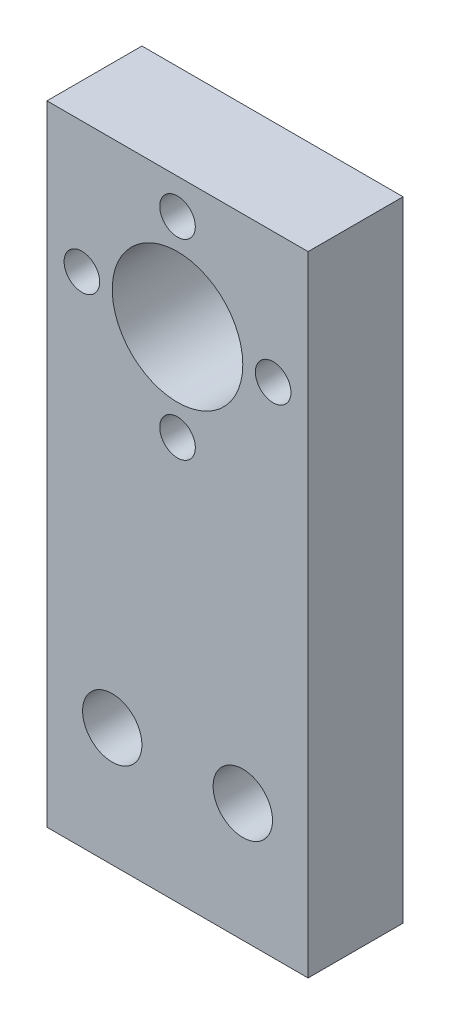
ISO-10303-21;
HEADER;
FILE_DESCRIPTION(('STEP AP214'),'2;1');
FILE_NAME('part.step','',(''),(''),'','','');
FILE_SCHEMA(('AUTOMOTIVE_DESIGN { 1 0 10303 214 1 1 1 1 }'));
ENDSEC;
DATA;
#1=APPLICATION_CONTEXT('core data for automotive mechanical design processes');
#2=APPLICATION_PROTOCOL_DEFINITION('international standard','automotive_design',2000,#1);
#3=PRODUCT_CONTEXT('',#1,'mechanical');
#4=PRODUCT('Part','Part','',(#3));
#5=PRODUCT_RELATED_PRODUCT_CATEGORY('part','',(#4));
#6=PRODUCT_DEFINITION_FORMATION('','',#4);
#7=PRODUCT_DEFINITION_CONTEXT('part definition',#1,'design');
#8=PRODUCT_DEFINITION('design','',#6,#7);
#9=PRODUCT_DEFINITION_SHAPE('','',#8);
#10=(LENGTH_UNIT() NAMED_UNIT(*) SI_UNIT(.MILLI.,.METRE.));
#11=(NAMED_UNIT(*) PLANE_ANGLE_UNIT() SI_UNIT($,.RADIAN.));
#12=(NAMED_UNIT(*) SI_UNIT($,.STERADIAN.) SOLID_ANGLE_UNIT());
#13=UNCERTAINTY_MEASURE_WITH_UNIT(LENGTH_MEASURE(1.E-05),#10,'distance_accuracy_value','');
#14=(GEOMETRIC_REPRESENTATION_CONTEXT(3) GLOBAL_UNCERTAINTY_ASSIGNED_CONTEXT((#13)) GLOBAL_UNIT_ASSIGNED_CONTEXT((#10,
#11,#12)) REPRESENTATION_CONTEXT('',''));
#15=CARTESIAN_POINT('',(0.,0.,0.));
#16=DIRECTION('',(0.,0.,1.));
#17=DIRECTION('',(1.,0.,0.));
#18=AXIS2_PLACEMENT_3D('',#15,#16,#17);
#19=CARTESIAN_POINT('',(0.,0.,8.));
#20=DIRECTION('',(0.,0.,1.));
#21=DIRECTION('',(1.,0.,0.));
#22=AXIS2_PLACEMENT_3D('',#19,#20,#21);
#23=PLANE('',#22);
#24=CARTESIAN_POINT('',(-7.00884955752212,4.74282834419709,8.));
#25=DIRECTION('',(0.,0.,1.));
#26=DIRECTION('',(1.,0.,0.));
#27=AXIS2_PLACEMENT_3D('',#24,#25,#26);
#28=CIRCLE('',#27,1.5);
#29=CARTESIAN_POINT('',(-5.50884955752212,4.74282834419709,8.));
#30=VERTEX_POINT('',#29);
#31=EDGE_CURVE('E138',#30,#30,#28,.T.);
#32=ORIENTED_EDGE('',*,*,#31,.F.);
#33=EDGE_LOOP('',(#32));
#34=FACE_BOUND('',#33,.T.);
#35=CARTESIAN_POINT('',(-7.00884955752212,20.8589415673073,8.));
#36=DIRECTION('',(0.,0.,1.));
#37=DIRECTION('',(1.,0.,0.));
#38=AXIS2_PLACEMENT_3D('',#35,#36,#37);
#39=CIRCLE('',#38,1.5);
#40=CARTESIAN_POINT('',(-5.50884955752212,20.8589415673073,8.));
#41=VERTEX_POINT('',#40);
#42=EDGE_CURVE('E126',#41,#41,#39,.T.);
#43=ORIENTED_EDGE('',*,*,#42,.F.);
#44=EDGE_LOOP('',(#43));
#45=FACE_BOUND('',#44,.T.);
#46=CARTESIAN_POINT('',(-1.50884955752212,-19.1991150442478,8.));
#47=DIRECTION('',(0.,0.,1.));
#48=DIRECTION('',(1.,0.,0.));
#49=AXIS2_PLACEMENT_3D('',#46,#47,#48);
#50=CIRCLE('',#49,2.5);
#51=CARTESIAN_POINT('',(0.99115044247788,-19.1991150442478,8.));
#52=VERTEX_POINT('',#51);
#53=EDGE_CURVE('E114',#52,#52,#50,.T.);
#54=ORIENTED_EDGE('',*,*,#53,.F.);
#55=EDGE_LOOP('',(#54));
#56=FACE_BOUND('',#55,.T.);
#57=DIRECTION('',(0.,1.,0.));
#58=VECTOR('',#57,1.);
#59=CARTESIAN_POINT('',(3.99115044247787,23.8008849557522,8.));
#60=LINE('',#59,#58);
#61=CARTESIAN_POINT('',(3.99115044247788,-29.1991150442478,8.));
#62=VERTEX_POINT('',#61);
#63=CARTESIAN_POINT('',(3.99115044247787,23.8008849557522,8.));
#64=VERTEX_POINT('',#63);
#65=EDGE_CURVE('E84',#62,#64,#60,.T.);
#66=ORIENTED_EDGE('',*,*,#65,.T.);
#67=DIRECTION('',(-1.,0.,0.));
#68=VECTOR('',#67,1.);
#69=CARTESIAN_POINT('',(-18.0088495575221,23.8008849557522,8.));
#70=LINE('',#69,#68);
#71=CARTESIAN_POINT('',(-18.0088495575221,23.8008849557522,8.));
#72=VERTEX_POINT('',#71);
#73=EDGE_CURVE('E79',#64,#72,#70,.T.);
#74=ORIENTED_EDGE('',*,*,#73,.T.);
#75=DIRECTION('',(0.,-1.,0.));
#76=VECTOR('',#75,1.);
#77=CARTESIAN_POINT('',(-18.0088495575221,23.8008849557522,8.));
#78=LINE('',#77,#76);
#79=CARTESIAN_POINT('',(-18.0088495575221,-29.1991150442478,8.));
#80=VERTEX_POINT('',#79);
#81=EDGE_CURVE('E82',#72,#80,#78,.T.);
#82=ORIENTED_EDGE('',*,*,#81,.T.);
#83=DIRECTION('',(1.,0.,0.));
#84=VECTOR('',#83,1.);
#85=CARTESIAN_POINT('',(-18.0088495575221,-29.1991150442478,8.));
#86=LINE('',#85,#84);
#87=EDGE_CURVE('E49',#80,#62,#86,.T.);
#88=ORIENTED_EDGE('',*,*,#87,.T.);
#89=EDGE_LOOP('',(#66,#74,#82,#88));
#90=FACE_BOUND('',#89,.T.);
#91=CARTESIAN_POINT('',(-12.5088495575221,-19.1991150442478,8.));
#92=DIRECTION('',(0.,0.,1.));
#93=DIRECTION('',(1.,0.,0.));
#94=AXIS2_PLACEMENT_3D('',#91,#92,#93);
#95=CIRCLE('',#94,2.5);
#96=CARTESIAN_POINT('',(-10.0088495575221,-19.1991150442478,8.));
#97=VERTEX_POINT('',#96);
#98=EDGE_CURVE('E99',#97,#97,#95,.T.);
#99=ORIENTED_EDGE('',*,*,#98,.F.);
#100=EDGE_LOOP('',(#99));
#101=FACE_BOUND('',#100,.T.);
#102=CARTESIAN_POINT('',(-7.00884955752212,12.8008849557522,8.));
#103=DIRECTION('',(0.,0.,1.));
#104=DIRECTION('',(1.,0.,0.));
#105=AXIS2_PLACEMENT_3D('',#102,#103,#104);
#106=CIRCLE('',#105,5.5);
#107=CARTESIAN_POINT('',(-1.50884955752212,12.8008849557522,8.));
#108=VERTEX_POINT('',#107);
#109=EDGE_CURVE('E120',#108,#108,#106,.T.);
#110=ORIENTED_EDGE('',*,*,#109,.F.);
#111=EDGE_LOOP('',(#110));
#112=FACE_BOUND('',#111,.T.);
#113=CARTESIAN_POINT('',(1.04920705403299,12.8008849557522,8.));
#114=DIRECTION('',(0.,0.,1.));
#115=DIRECTION('',(1.,0.,0.));
#116=AXIS2_PLACEMENT_3D('',#113,#114,#115);
#117=CIRCLE('',#116,1.5);
#118=CARTESIAN_POINT('',(2.54920705403299,12.8008849557522,8.));
#119=VERTEX_POINT('',#118);
#120=EDGE_CURVE('E132',#119,#119,#117,.T.);
#121=ORIENTED_EDGE('',*,*,#120,.F.);
#122=EDGE_LOOP('',(#121));
#123=FACE_BOUND('',#122,.T.);
#124=CARTESIAN_POINT('',(-15.0669061690772,12.8008849557522,8.));
#125=DIRECTION('',(0.,0.,1.));
#126=DIRECTION('',(1.,0.,0.));
#127=AXIS2_PLACEMENT_3D('',#124,#125,#126);
#128=CIRCLE('',#127,1.5);
#129=CARTESIAN_POINT('',(-13.5669061690772,12.8008849557522,8.));
#130=VERTEX_POINT('',#129);
#131=EDGE_CURVE('E144',#130,#130,#128,.T.);
#132=ORIENTED_EDGE('',*,*,#131,.F.);
#133=EDGE_LOOP('',(#132));
#134=FACE_BOUND('',#133,.T.);
#135=ADVANCED_FACE('F32',(#34,#45,#56,#90,#101,#112,#123,#134),#23,.T.);
#136=CARTESIAN_POINT('',(0.,0.,0.));
#137=DIRECTION('',(0.,0.,1.));
#138=DIRECTION('',(1.,0.,0.));
#139=AXIS2_PLACEMENT_3D('',#136,#137,#138);
#140=PLANE('',#139);
#141=DIRECTION('',(0.,1.,0.));
#142=VECTOR('',#141,1.);
#143=CARTESIAN_POINT('',(3.99115044247787,23.8008849557522,0.));
#144=LINE('',#143,#142);
#145=CARTESIAN_POINT('',(3.99115044247788,-29.1991150442478,0.));
#146=VERTEX_POINT('',#145);
#147=CARTESIAN_POINT('',(3.99115044247787,23.8008849557522,0.));
#148=VERTEX_POINT('',#147);
#149=EDGE_CURVE('E96',#146,#148,#144,.T.);
#150=ORIENTED_EDGE('',*,*,#149,.F.);
#151=DIRECTION('',(1.,0.,0.));
#152=VECTOR('',#151,1.);
#153=CARTESIAN_POINT('',(-18.0088495575221,-29.1991150442478,0.));
#154=LINE('',#153,#152);
#155=CARTESIAN_POINT('',(-18.0088495575221,-29.1991150442478,0.));
#156=VERTEX_POINT('',#155);
#157=EDGE_CURVE('E72',#156,#146,#154,.T.);
#158=ORIENTED_EDGE('',*,*,#157,.F.);
#159=DIRECTION('',(0.,-1.,0.));
#160=VECTOR('',#159,1.);
#161=CARTESIAN_POINT('',(-18.0088495575221,23.8008849557522,0.));
#162=LINE('',#161,#160);
#163=CARTESIAN_POINT('',(-18.0088495575221,23.8008849557522,0.));
#164=VERTEX_POINT('',#163);
#165=EDGE_CURVE('E66',#164,#156,#162,.T.);
#166=ORIENTED_EDGE('',*,*,#165,.F.);
#167=DIRECTION('',(-1.,0.,0.));
#168=VECTOR('',#167,1.);
#169=CARTESIAN_POINT('',(-18.0088495575221,23.8008849557522,0.));
#170=LINE('',#169,#168);
#171=EDGE_CURVE('E88',#148,#164,#170,.T.);
#172=ORIENTED_EDGE('',*,*,#171,.F.);
#173=EDGE_LOOP('',(#150,#158,#166,#172));
#174=FACE_BOUND('',#173,.T.);
#175=CARTESIAN_POINT('',(-12.5088495575221,-19.1991150442478,0.));
#176=DIRECTION('',(0.,0.,1.));
#177=DIRECTION('',(1.,0.,0.));
#178=AXIS2_PLACEMENT_3D('',#175,#176,#177);
#179=CIRCLE('',#178,2.5);
#180=CARTESIAN_POINT('',(-10.0088495575221,-19.1991150442478,0.));
#181=VERTEX_POINT('',#180);
#182=EDGE_CURVE('E111',#181,#181,#179,.T.);
#183=ORIENTED_EDGE('',*,*,#182,.T.);
#184=EDGE_LOOP('',(#183));
#185=FACE_BOUND('',#184,.T.);
#186=CARTESIAN_POINT('',(-1.50884955752212,-19.1991150442478,0.));
#187=DIRECTION('',(0.,0.,1.));
#188=DIRECTION('',(1.,0.,0.));
#189=AXIS2_PLACEMENT_3D('',#186,#187,#188);
#190=CIRCLE('',#189,2.5);
#191=CARTESIAN_POINT('',(0.99115044247788,-19.1991150442478,0.));
#192=VERTEX_POINT('',#191);
#193=EDGE_CURVE('E117',#192,#192,#190,.T.);
#194=ORIENTED_EDGE('',*,*,#193,.T.);
#195=EDGE_LOOP('',(#194));
#196=FACE_BOUND('',#195,.T.);
#197=CARTESIAN_POINT('',(-7.00884955752212,12.8008849557522,0.));
#198=DIRECTION('',(0.,0.,1.));
#199=DIRECTION('',(1.,0.,0.));
#200=AXIS2_PLACEMENT_3D('',#197,#198,#199);
#201=CIRCLE('',#200,5.5);
#202=CARTESIAN_POINT('',(-1.50884955752212,12.8008849557522,0.));
#203=VERTEX_POINT('',#202);
#204=EDGE_CURVE('E123',#203,#203,#201,.T.);
#205=ORIENTED_EDGE('',*,*,#204,.T.);
#206=EDGE_LOOP('',(#205));
#207=FACE_BOUND('',#206,.T.);
#208=CARTESIAN_POINT('',(-7.00884955752212,20.8589415673073,0.));
#209=DIRECTION('',(0.,0.,1.));
#210=DIRECTION('',(1.,0.,0.));
#211=AXIS2_PLACEMENT_3D('',#208,#209,#210);
#212=CIRCLE('',#211,1.5);
#213=CARTESIAN_POINT('',(-5.50884955752212,20.8589415673073,0.));
#214=VERTEX_POINT('',#213);
#215=EDGE_CURVE('E129',#214,#214,#212,.T.);
#216=ORIENTED_EDGE('',*,*,#215,.T.);
#217=EDGE_LOOP('',(#216));
#218=FACE_BOUND('',#217,.T.);
#219=CARTESIAN_POINT('',(1.04920705403299,12.8008849557522,0.));
#220=DIRECTION('',(0.,0.,1.));
#221=DIRECTION('',(1.,0.,0.));
#222=AXIS2_PLACEMENT_3D('',#219,#220,#221);
#223=CIRCLE('',#222,1.5);
#224=CARTESIAN_POINT('',(2.54920705403299,12.8008849557522,0.));
#225=VERTEX_POINT('',#224);
#226=EDGE_CURVE('E135',#225,#225,#223,.T.);
#227=ORIENTED_EDGE('',*,*,#226,.T.);
#228=EDGE_LOOP('',(#227));
#229=FACE_BOUND('',#228,.T.);
#230=CARTESIAN_POINT('',(-7.00884955752212,4.74282834419709,0.));
#231=DIRECTION('',(0.,0.,1.));
#232=DIRECTION('',(1.,0.,0.));
#233=AXIS2_PLACEMENT_3D('',#230,#231,#232);
#234=CIRCLE('',#233,1.5);
#235=CARTESIAN_POINT('',(-5.50884955752212,4.74282834419709,0.));
#236=VERTEX_POINT('',#235);
#237=EDGE_CURVE('E141',#236,#236,#234,.T.);
#238=ORIENTED_EDGE('',*,*,#237,.T.);
#239=EDGE_LOOP('',(#238));
#240=FACE_BOUND('',#239,.T.);
#241=CARTESIAN_POINT('',(-15.0669061690772,12.8008849557522,0.));
#242=DIRECTION('',(0.,0.,1.));
#243=DIRECTION('',(1.,0.,0.));
#244=AXIS2_PLACEMENT_3D('',#241,#242,#243);
#245=CIRCLE('',#244,1.5);
#246=CARTESIAN_POINT('',(-13.5669061690772,12.8008849557522,0.));
#247=VERTEX_POINT('',#246);
#248=EDGE_CURVE('E147',#247,#247,#245,.T.);
#249=ORIENTED_EDGE('',*,*,#248,.T.);
#250=EDGE_LOOP('',(#249));
#251=FACE_BOUND('',#250,.T.);
#252=ADVANCED_FACE('F107',(#174,#185,#196,#207,#218,#229,#240,#251),#140,.F.);
#253=CARTESIAN_POINT('',(3.99115044247787,23.8008849557522,8.));
#254=DIRECTION('',(-1.,0.,0.));
#255=DIRECTION('',(0.,-1.,0.));
#256=AXIS2_PLACEMENT_3D('',#253,#254,#255);
#257=PLANE('',#256);
#258=ORIENTED_EDGE('',*,*,#149,.T.);
#259=DIRECTION('',(0.,0.,-1.));
#260=VECTOR('',#259,1.);
#261=CARTESIAN_POINT('',(3.99115044247787,23.8008849557522,8.));
#262=LINE('',#261,#260);
#263=EDGE_CURVE('E11',#64,#148,#262,.T.);
#264=ORIENTED_EDGE('',*,*,#263,.F.);
#265=ORIENTED_EDGE('',*,*,#65,.F.);
#266=DIRECTION('',(0.,0.,-1.));
#267=VECTOR('',#266,1.);
#268=CARTESIAN_POINT('',(3.99115044247788,-29.1991150442478,8.));
#269=LINE('',#268,#267);
#270=EDGE_CURVE('E92',#62,#146,#269,.T.);
#271=ORIENTED_EDGE('',*,*,#270,.T.);
#272=EDGE_LOOP('',(#258,#264,#265,#271));
#273=FACE_BOUND('',#272,.T.);
#274=ADVANCED_FACE('F34',(#273),#257,.F.);
#275=CARTESIAN_POINT('',(-18.0088495575221,23.8008849557522,8.));
#276=DIRECTION('',(0.,-1.,0.));
#277=DIRECTION('',(0.,0.,-1.));
#278=AXIS2_PLACEMENT_3D('',#275,#276,#277);
#279=PLANE('',#278);
#280=ORIENTED_EDGE('',*,*,#171,.T.);
#281=DIRECTION('',(0.,0.,-1.));
#282=VECTOR('',#281,1.);
#283=CARTESIAN_POINT('',(-18.0088495575221,23.8008849557522,8.));
#284=LINE('',#283,#282);
#285=EDGE_CURVE('E41',#72,#164,#284,.T.);
#286=ORIENTED_EDGE('',*,*,#285,.F.);
#287=ORIENTED_EDGE('',*,*,#73,.F.);
#288=ORIENTED_EDGE('',*,*,#263,.T.);
#289=EDGE_LOOP('',(#280,#286,#287,#288));
#290=FACE_BOUND('',#289,.T.);
#291=ADVANCED_FACE('F87',(#290),#279,.F.);
#292=CARTESIAN_POINT('',(-18.0088495575221,23.8008849557522,8.));
#293=DIRECTION('',(1.,0.,0.));
#294=DIRECTION('',(0.,1.,0.));
#295=AXIS2_PLACEMENT_3D('',#292,#293,#294);
#296=PLANE('',#295);
#297=ORIENTED_EDGE('',*,*,#165,.T.);
#298=DIRECTION('',(0.,0.,-1.));
#299=VECTOR('',#298,1.);
#300=CARTESIAN_POINT('',(-18.0088495575221,-29.1991150442478,8.));
#301=LINE('',#300,#299);
#302=EDGE_CURVE('E89',#80,#156,#301,.T.);
#303=ORIENTED_EDGE('',*,*,#302,.F.);
#304=ORIENTED_EDGE('',*,*,#81,.F.);
#305=ORIENTED_EDGE('',*,*,#285,.T.);
#306=EDGE_LOOP('',(#297,#303,#304,#305));
#307=FACE_BOUND('',#306,.T.);
#308=ADVANCED_FACE('F90',(#307),#296,.F.);
#309=CARTESIAN_POINT('',(-18.0088495575221,-29.1991150442478,8.));
#310=DIRECTION('',(0.,1.,0.));
#311=DIRECTION('',(0.,0.,1.));
#312=AXIS2_PLACEMENT_3D('',#309,#310,#311);
#313=PLANE('',#312);
#314=ORIENTED_EDGE('',*,*,#157,.T.);
#315=ORIENTED_EDGE('',*,*,#270,.F.);
#316=ORIENTED_EDGE('',*,*,#87,.F.);
#317=ORIENTED_EDGE('',*,*,#302,.T.);
#318=EDGE_LOOP('',(#314,#315,#316,#317));
#319=FACE_BOUND('',#318,.T.);
#320=ADVANCED_FACE('F104',(#319),#313,.F.);
#321=CARTESIAN_POINT('',(-12.5088495575221,-19.1991150442478,8.));
#322=DIRECTION('',(0.,0.,-1.));
#323=DIRECTION('',(-1.,0.,0.));
#324=AXIS2_PLACEMENT_3D('',#321,#322,#323);
#325=CYLINDRICAL_SURFACE('',#324,2.5);
#326=ORIENTED_EDGE('',*,*,#98,.T.);
#327=EDGE_LOOP('',(#326));
#328=FACE_BOUND('',#327,.T.);
#329=ORIENTED_EDGE('',*,*,#182,.F.);
#330=EDGE_LOOP('',(#329));
#331=FACE_BOUND('',#330,.T.);
#332=ADVANCED_FACE('F166',(#328,#331),#325,.F.);
#333=CARTESIAN_POINT('',(-1.50884955752212,-19.1991150442478,8.));
#334=DIRECTION('',(0.,0.,-1.));
#335=DIRECTION('',(-1.,0.,0.));
#336=AXIS2_PLACEMENT_3D('',#333,#334,#335);
#337=CYLINDRICAL_SURFACE('',#336,2.5);
#338=ORIENTED_EDGE('',*,*,#53,.T.);
#339=EDGE_LOOP('',(#338));
#340=FACE_BOUND('',#339,.T.);
#341=ORIENTED_EDGE('',*,*,#193,.F.);
#342=EDGE_LOOP('',(#341));
#343=FACE_BOUND('',#342,.T.);
#344=ADVANCED_FACE('F212',(#340,#343),#337,.F.);
#345=CARTESIAN_POINT('',(-7.00884955752212,12.8008849557522,8.));
#346=DIRECTION('',(0.,0.,-1.));
#347=DIRECTION('',(-1.,0.,0.));
#348=AXIS2_PLACEMENT_3D('',#345,#346,#347);
#349=CYLINDRICAL_SURFACE('',#348,5.5);
#350=ORIENTED_EDGE('',*,*,#109,.T.);
#351=EDGE_LOOP('',(#350));
#352=FACE_BOUND('',#351,.T.);
#353=ORIENTED_EDGE('',*,*,#204,.F.);
#354=EDGE_LOOP('',(#353));
#355=FACE_BOUND('',#354,.T.);
#356=ADVANCED_FACE('F220',(#352,#355),#349,.F.);
#357=CARTESIAN_POINT('',(-7.00884955752212,20.8589415673073,8.));
#358=DIRECTION('',(0.,0.,-1.));
#359=DIRECTION('',(-1.,0.,0.));
#360=AXIS2_PLACEMENT_3D('',#357,#358,#359);
#361=CYLINDRICAL_SURFACE('',#360,1.5);
#362=ORIENTED_EDGE('',*,*,#42,.T.);
#363=EDGE_LOOP('',(#362));
#364=FACE_BOUND('',#363,.T.);
#365=ORIENTED_EDGE('',*,*,#215,.F.);
#366=EDGE_LOOP('',(#365));
#367=FACE_BOUND('',#366,.T.);
#368=ADVANCED_FACE('F228',(#364,#367),#361,.F.);
#369=CARTESIAN_POINT('',(1.04920705403299,12.8008849557522,8.));
#370=DIRECTION('',(0.,0.,-1.));
#371=DIRECTION('',(-1.,0.,0.));
#372=AXIS2_PLACEMENT_3D('',#369,#370,#371);
#373=CYLINDRICAL_SURFACE('',#372,1.5);
#374=ORIENTED_EDGE('',*,*,#120,.T.);
#375=EDGE_LOOP('',(#374));
#376=FACE_BOUND('',#375,.T.);
#377=ORIENTED_EDGE('',*,*,#226,.F.);
#378=EDGE_LOOP('',(#377));
#379=FACE_BOUND('',#378,.T.);
#380=ADVANCED_FACE('F237',(#376,#379),#373,.F.);
#381=CARTESIAN_POINT('',(-7.00884955752212,4.74282834419709,8.));
#382=DIRECTION('',(0.,0.,-1.));
#383=DIRECTION('',(-1.,0.,0.));
#384=AXIS2_PLACEMENT_3D('',#381,#382,#383);
#385=CYLINDRICAL_SURFACE('',#384,1.5);
#386=ORIENTED_EDGE('',*,*,#31,.T.);
#387=EDGE_LOOP('',(#386));
#388=FACE_BOUND('',#387,.T.);
#389=ORIENTED_EDGE('',*,*,#237,.F.);
#390=EDGE_LOOP('',(#389));
#391=FACE_BOUND('',#390,.T.);
#392=ADVANCED_FACE('F246',(#388,#391),#385,.F.);
#393=CARTESIAN_POINT('',(-15.0669061690772,12.8008849557522,8.));
#394=DIRECTION('',(0.,0.,-1.));
#395=DIRECTION('',(-1.,0.,0.));
#396=AXIS2_PLACEMENT_3D('',#393,#394,#395);
#397=CYLINDRICAL_SURFACE('',#396,1.5);
#398=ORIENTED_EDGE('',*,*,#131,.T.);
#399=EDGE_LOOP('',(#398));
#400=FACE_BOUND('',#399,.T.);
#401=ORIENTED_EDGE('',*,*,#248,.F.);
#402=EDGE_LOOP('',(#401));
#403=FACE_BOUND('',#402,.T.);
#404=ADVANCED_FACE('F153',(#400,#403),#397,.F.);
#405=CLOSED_SHELL('',(#135,#252,#274,#291,#308,#320,#332,#344,#356,#368,#380,#392,#404));
#406=MANIFOLD_SOLID_BREP('B2',#405);
#407=ADVANCED_BREP_SHAPE_REPRESENTATION('',(#18,#406),#14);
#408=SHAPE_DEFINITION_REPRESENTATION(#9,#407);
ENDSEC;
END-ISO-10303-21;
